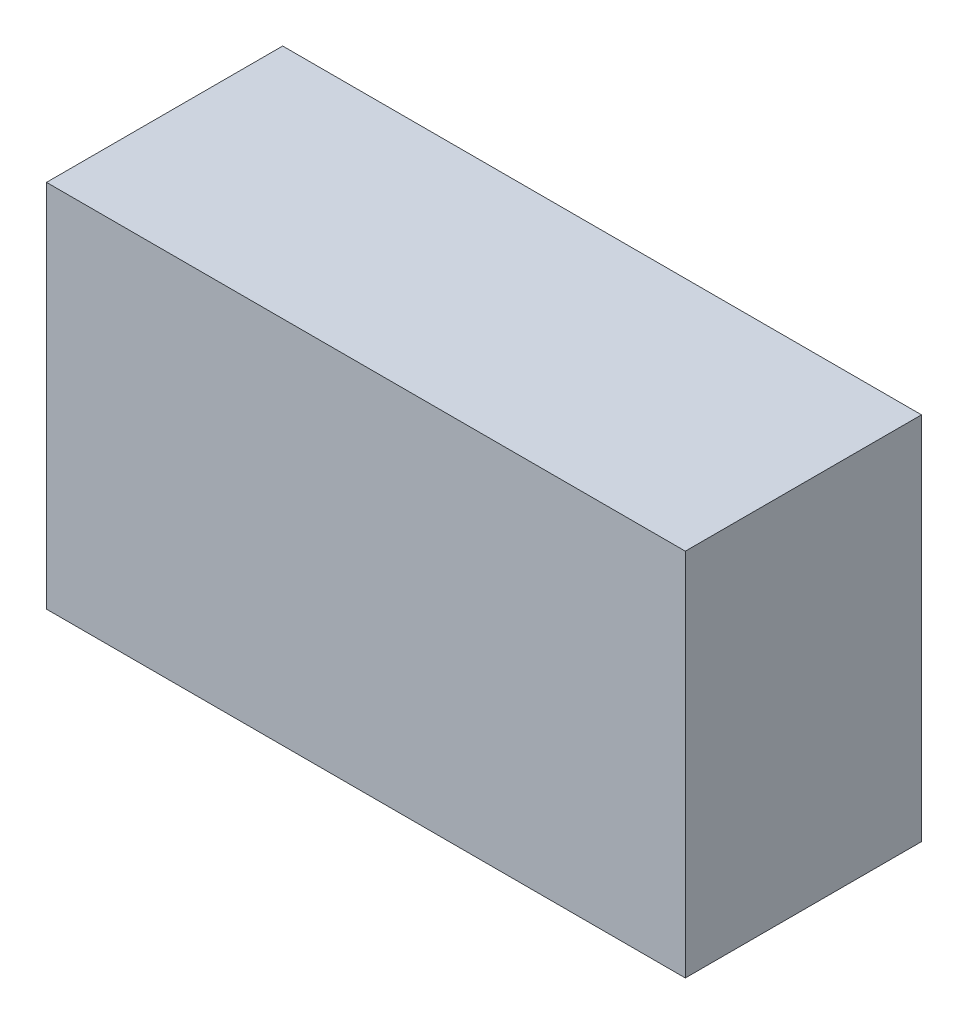
ISO-10303-21;
HEADER;
FILE_DESCRIPTION(('STEP AP214'),'2;1');
FILE_NAME('part.step','',(''),(''),'','','');
FILE_SCHEMA(('AUTOMOTIVE_DESIGN { 1 0 10303 214 1 1 1 1 }'));
ENDSEC;
DATA;
#1=APPLICATION_CONTEXT('core data for automotive mechanical design processes');
#2=APPLICATION_PROTOCOL_DEFINITION('international standard','automotive_design',2000,#1);
#3=PRODUCT_CONTEXT('',#1,'mechanical');
#4=PRODUCT('Part','Part','',(#3));
#5=PRODUCT_RELATED_PRODUCT_CATEGORY('part','',(#4));
#6=PRODUCT_DEFINITION_FORMATION('','',#4);
#7=PRODUCT_DEFINITION_CONTEXT('part definition',#1,'design');
#8=PRODUCT_DEFINITION('design','',#6,#7);
#9=PRODUCT_DEFINITION_SHAPE('','',#8);
#10=(LENGTH_UNIT() NAMED_UNIT(*) SI_UNIT(.MILLI.,.METRE.));
#11=(NAMED_UNIT(*) PLANE_ANGLE_UNIT() SI_UNIT($,.RADIAN.));
#12=(NAMED_UNIT(*) SI_UNIT($,.STERADIAN.) SOLID_ANGLE_UNIT());
#13=UNCERTAINTY_MEASURE_WITH_UNIT(LENGTH_MEASURE(1.E-05),#10,'distance_accuracy_value','');
#14=(GEOMETRIC_REPRESENTATION_CONTEXT(3) GLOBAL_UNCERTAINTY_ASSIGNED_CONTEXT((#13)) GLOBAL_UNIT_ASSIGNED_CONTEXT((#10,
#11,#12)) REPRESENTATION_CONTEXT('',''));
#15=CARTESIAN_POINT('',(0.,0.,0.));
#16=DIRECTION('',(0.,0.,1.));
#17=DIRECTION('',(1.,0.,0.));
#18=AXIS2_PLACEMENT_3D('',#15,#16,#17);
#19=CARTESIAN_POINT('',(24.4999999999123,66.4663391035948,74.7260757938058));
#20=DIRECTION('',(-1.,0.,0.));
#21=DIRECTION('',(0.,-1.,0.));
#22=AXIS2_PLACEMENT_3D('',#19,#20,#21);
#23=PLANE('',#22);
#24=DIRECTION('',(0.,1.,0.));
#25=VECTOR('',#24,1.);
#26=CARTESIAN_POINT('',(24.4999999999123,66.4663391035948,18.1140000000001));
#27=LINE('',#26,#25);
#28=CARTESIAN_POINT('',(24.4999999999123,38.1127304145335,18.1140000000001));
#29=VERTEX_POINT('',#28);
#30=CARTESIAN_POINT('',(24.4999999999123,66.4663391035948,18.1140000000001));
#31=VERTEX_POINT('',#30);
#32=EDGE_CURVE('E91',#29,#31,#27,.T.);
#33=ORIENTED_EDGE('',*,*,#32,.F.);
#34=DIRECTION('',(0.,0.,-1.));
#35=VECTOR('',#34,1.);
#36=CARTESIAN_POINT('',(24.4999999999123,38.1127304145335,74.7260757938058));
#37=LINE('',#36,#35);
#38=CARTESIAN_POINT('',(24.4999999999123,38.1127304145335,0.));
#39=VERTEX_POINT('',#38);
#40=EDGE_CURVE('E45',#29,#39,#37,.T.);
#41=ORIENTED_EDGE('',*,*,#40,.T.);
#42=DIRECTION('',(0.,1.,0.));
#43=VECTOR('',#42,1.);
#44=CARTESIAN_POINT('',(24.4999999999123,66.4663391035948,0.));
#45=LINE('',#44,#43);
#46=CARTESIAN_POINT('',(24.4999999999123,66.4663391035948,0.));
#47=VERTEX_POINT('',#46);
#48=EDGE_CURVE('E89',#39,#47,#45,.T.);
#49=ORIENTED_EDGE('',*,*,#48,.T.);
#50=DIRECTION('',(0.,0.,-1.));
#51=VECTOR('',#50,1.);
#52=CARTESIAN_POINT('',(24.4999999999123,66.4663391035948,74.7260757938058));
#53=LINE('',#52,#51);
#54=EDGE_CURVE('E80',#31,#47,#53,.T.);
#55=ORIENTED_EDGE('',*,*,#54,.F.);
#56=EDGE_LOOP('',(#33,#41,#49,#55));
#57=FACE_BOUND('',#56,.T.);
#58=ADVANCED_FACE('F41',(#57),#23,.F.);
#59=CARTESIAN_POINT('',(24.4999999999123,66.4663391035948,74.7260757938058));
#60=DIRECTION('',(0.,-1.,0.));
#61=DIRECTION('',(0.,0.,-1.));
#62=AXIS2_PLACEMENT_3D('',#59,#60,#61);
#63=PLANE('',#62);
#64=DIRECTION('',(-1.,0.,0.));
#65=VECTOR('',#64,1.);
#66=CARTESIAN_POINT('',(24.4999999999123,66.4663391035948,18.1140000000001));
#67=LINE('',#66,#65);
#68=CARTESIAN_POINT('',(-24.4999999999979,66.4663391035948,18.1140000000001));
#69=VERTEX_POINT('',#68);
#70=EDGE_CURVE('E50',#31,#69,#67,.T.);
#71=ORIENTED_EDGE('',*,*,#70,.F.);
#72=ORIENTED_EDGE('',*,*,#54,.T.);
#73=DIRECTION('',(-1.,0.,0.));
#74=VECTOR('',#73,1.);
#75=CARTESIAN_POINT('',(24.4999999999123,66.4663391035948,0.));
#76=LINE('',#75,#74);
#77=CARTESIAN_POINT('',(-24.4999999999979,66.4663391035948,0.));
#78=VERTEX_POINT('',#77);
#79=EDGE_CURVE('E101',#47,#78,#76,.T.);
#80=ORIENTED_EDGE('',*,*,#79,.T.);
#81=DIRECTION('',(0.,0.,-1.));
#82=VECTOR('',#81,1.);
#83=CARTESIAN_POINT('',(-24.4999999999979,66.4663391035948,74.7260757938058));
#84=LINE('',#83,#82);
#85=EDGE_CURVE('E110',#69,#78,#84,.T.);
#86=ORIENTED_EDGE('',*,*,#85,.F.);
#87=EDGE_LOOP('',(#71,#72,#80,#86));
#88=FACE_BOUND('',#87,.T.);
#89=ADVANCED_FACE('F114',(#88),#63,.F.);
#90=CARTESIAN_POINT('',(-24.4999999999979,66.4663391035948,74.7260757938058));
#91=DIRECTION('',(1.,0.,0.));
#92=DIRECTION('',(0.,1.,0.));
#93=AXIS2_PLACEMENT_3D('',#90,#91,#92);
#94=PLANE('',#93);
#95=DIRECTION('',(0.,-1.,0.));
#96=VECTOR('',#95,1.);
#97=CARTESIAN_POINT('',(-24.4999999999979,66.4663391035948,18.1140000000001));
#98=LINE('',#97,#96);
#99=CARTESIAN_POINT('',(-24.4999999999979,38.1127304145335,18.1140000000001));
#100=VERTEX_POINT('',#99);
#101=EDGE_CURVE('E11',#69,#100,#98,.T.);
#102=ORIENTED_EDGE('',*,*,#101,.F.);
#103=ORIENTED_EDGE('',*,*,#85,.T.);
#104=DIRECTION('',(0.,-1.,0.));
#105=VECTOR('',#104,1.);
#106=CARTESIAN_POINT('',(-24.4999999999979,66.4663391035948,0.));
#107=LINE('',#106,#105);
#108=CARTESIAN_POINT('',(-24.4999999999979,38.1127304145335,0.));
#109=VERTEX_POINT('',#108);
#110=EDGE_CURVE('E111',#78,#109,#107,.T.);
#111=ORIENTED_EDGE('',*,*,#110,.T.);
#112=DIRECTION('',(0.,0.,-1.));
#113=VECTOR('',#112,1.);
#114=CARTESIAN_POINT('',(-24.4999999999979,38.1127304145335,74.7260757938058));
#115=LINE('',#114,#113);
#116=EDGE_CURVE('E63',#100,#109,#115,.T.);
#117=ORIENTED_EDGE('',*,*,#116,.F.);
#118=EDGE_LOOP('',(#102,#103,#111,#117));
#119=FACE_BOUND('',#118,.T.);
#120=ADVANCED_FACE('F113',(#119),#94,.F.);
#121=CARTESIAN_POINT('',(24.4999999999123,38.1127304145335,74.7260757938058));
#122=DIRECTION('',(0.,1.,0.));
#123=DIRECTION('',(-1.,0.,0.));
#124=AXIS2_PLACEMENT_3D('',#121,#122,#123);
#125=PLANE('',#124);
#126=DIRECTION('',(1.,0.,0.));
#127=VECTOR('',#126,1.);
#128=CARTESIAN_POINT('',(24.4999999999123,38.1127304145335,18.1140000000001));
#129=LINE('',#128,#127);
#130=EDGE_CURVE('E98',#100,#29,#129,.T.);
#131=ORIENTED_EDGE('',*,*,#130,.F.);
#132=ORIENTED_EDGE('',*,*,#116,.T.);
#133=DIRECTION('',(1.,0.,0.));
#134=VECTOR('',#133,1.);
#135=CARTESIAN_POINT('',(24.4999999999123,38.1127304145335,0.));
#136=LINE('',#135,#134);
#137=EDGE_CURVE('E94',#109,#39,#136,.T.);
#138=ORIENTED_EDGE('',*,*,#137,.T.);
#139=ORIENTED_EDGE('',*,*,#40,.F.);
#140=EDGE_LOOP('',(#131,#132,#138,#139));
#141=FACE_BOUND('',#140,.T.);
#142=ADVANCED_FACE('F95',(#141),#125,.F.);
#143=CARTESIAN_POINT('',(0.,0.,0.));
#144=DIRECTION('',(0.,0.,-1.));
#145=DIRECTION('',(-1.,0.,0.));
#146=AXIS2_PLACEMENT_3D('',#143,#144,#145);
#147=PLANE('',#146);
#148=ORIENTED_EDGE('',*,*,#48,.F.);
#149=ORIENTED_EDGE('',*,*,#137,.F.);
#150=ORIENTED_EDGE('',*,*,#110,.F.);
#151=ORIENTED_EDGE('',*,*,#79,.F.);
#152=EDGE_LOOP('',(#148,#149,#150,#151));
#153=FACE_BOUND('',#152,.T.);
#154=ADVANCED_FACE('F100',(#153),#147,.T.);
#155=CARTESIAN_POINT('',(2.21722680368159E-12,1.10836439232947E-12,18.1140000000001));
#156=DIRECTION('',(0.,0.,1.));
#157=DIRECTION('',(0.,-1.,0.));
#158=AXIS2_PLACEMENT_3D('',#155,#156,#157);
#159=PLANE('',#158);
#160=ORIENTED_EDGE('',*,*,#130,.T.);
#161=ORIENTED_EDGE('',*,*,#32,.T.);
#162=ORIENTED_EDGE('',*,*,#70,.T.);
#163=ORIENTED_EDGE('',*,*,#101,.T.);
#164=EDGE_LOOP('',(#160,#161,#162,#163));
#165=FACE_BOUND('',#164,.T.);
#166=ADVANCED_FACE('F43',(#165),#159,.T.);
#167=CLOSED_SHELL('',(#58,#89,#120,#142,#154,#166));
#168=MANIFOLD_SOLID_BREP('B2',#167);
#169=ADVANCED_BREP_SHAPE_REPRESENTATION('',(#18,#168),#14);
#170=SHAPE_DEFINITION_REPRESENTATION(#9,#169);
ENDSEC;
END-ISO-10303-21;
